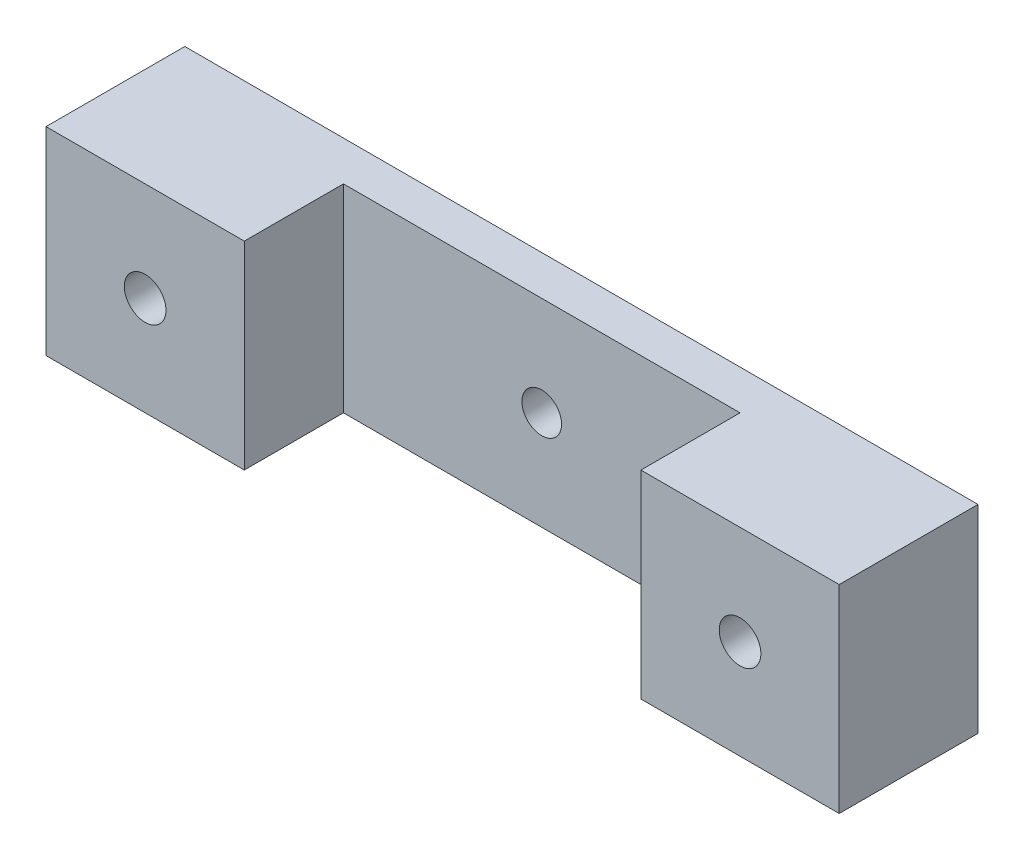
ISO-10303-21;
HEADER;
FILE_DESCRIPTION(('STEP AP214'),'2;1');
FILE_NAME('part.step','',(''),(''),'','','');
FILE_SCHEMA(('AUTOMOTIVE_DESIGN { 1 0 10303 214 1 1 1 1 }'));
ENDSEC;
DATA;
#1=APPLICATION_CONTEXT('core data for automotive mechanical design processes');
#2=APPLICATION_PROTOCOL_DEFINITION('international standard','automotive_design',2000,#1);
#3=PRODUCT_CONTEXT('',#1,'mechanical');
#4=PRODUCT('Part','Part','',(#3));
#5=PRODUCT_RELATED_PRODUCT_CATEGORY('part','',(#4));
#6=PRODUCT_DEFINITION_FORMATION('','',#4);
#7=PRODUCT_DEFINITION_CONTEXT('part definition',#1,'design');
#8=PRODUCT_DEFINITION('design','',#6,#7);
#9=PRODUCT_DEFINITION_SHAPE('','',#8);
#10=(LENGTH_UNIT() NAMED_UNIT(*) SI_UNIT(.MILLI.,.METRE.));
#11=(NAMED_UNIT(*) PLANE_ANGLE_UNIT() SI_UNIT($,.RADIAN.));
#12=(NAMED_UNIT(*) SI_UNIT($,.STERADIAN.) SOLID_ANGLE_UNIT());
#13=UNCERTAINTY_MEASURE_WITH_UNIT(LENGTH_MEASURE(1.E-05),#10,'distance_accuracy_value','');
#14=(GEOMETRIC_REPRESENTATION_CONTEXT(3) GLOBAL_UNCERTAINTY_ASSIGNED_CONTEXT((#13)) GLOBAL_UNIT_ASSIGNED_CONTEXT((#10,
#11,#12)) REPRESENTATION_CONTEXT('',''));
#15=CARTESIAN_POINT('',(0.,0.,0.));
#16=DIRECTION('',(0.,0.,1.));
#17=DIRECTION('',(1.,0.,0.));
#18=AXIS2_PLACEMENT_3D('',#15,#16,#17);
#19=CARTESIAN_POINT('',(0.,0.,4.));
#20=DIRECTION('',(0.,0.,-1.));
#21=DIRECTION('',(-1.,0.,0.));
#22=AXIS2_PLACEMENT_3D('',#19,#20,#21);
#23=PLANE('',#22);
#24=CARTESIAN_POINT('',(40.,10.,4.));
#25=DIRECTION('',(0.,0.,-1.));
#26=DIRECTION('',(-1.,0.,0.));
#27=AXIS2_PLACEMENT_3D('',#24,#25,#26);
#28=CIRCLE('',#27,2.);
#29=CARTESIAN_POINT('',(38.,10.,4.));
#30=VERTEX_POINT('',#29);
#31=EDGE_CURVE('E321',#30,#30,#28,.T.);
#32=ORIENTED_EDGE('',*,*,#31,.T.);
#33=EDGE_LOOP('',(#32));
#34=FACE_BOUND('',#33,.T.);
#35=DIRECTION('',(0.,-1.,0.));
#36=VECTOR('',#35,1.);
#37=CARTESIAN_POINT('',(60.,20.,4.));
#38=LINE('',#37,#36);
#39=CARTESIAN_POINT('',(60.,20.,4.));
#40=VERTEX_POINT('',#39);
#41=CARTESIAN_POINT('',(60.,0.,4.));
#42=VERTEX_POINT('',#41);
#43=EDGE_CURVE('E124',#40,#42,#38,.T.);
#44=ORIENTED_EDGE('',*,*,#43,.F.);
#45=DIRECTION('',(-1.,0.,0.));
#46=VECTOR('',#45,1.);
#47=CARTESIAN_POINT('',(0.,20.,4.));
#48=LINE('',#47,#46);
#49=CARTESIAN_POINT('',(20.,20.,4.));
#50=VERTEX_POINT('',#49);
#51=EDGE_CURVE('E156',#40,#50,#48,.T.);
#52=ORIENTED_EDGE('',*,*,#51,.T.);
#53=DIRECTION('',(0.,1.,0.));
#54=VECTOR('',#53,1.);
#55=CARTESIAN_POINT('',(20.,20.,4.));
#56=LINE('',#55,#54);
#57=CARTESIAN_POINT('',(20.,0.,4.));
#58=VERTEX_POINT('',#57);
#59=EDGE_CURVE('E55',#58,#50,#56,.T.);
#60=ORIENTED_EDGE('',*,*,#59,.F.);
#61=DIRECTION('',(1.,0.,0.));
#62=VECTOR('',#61,1.);
#63=CARTESIAN_POINT('',(0.,0.,4.));
#64=LINE('',#63,#62);
#65=EDGE_CURVE('E50',#58,#42,#64,.T.);
#66=ORIENTED_EDGE('',*,*,#65,.T.);
#67=EDGE_LOOP('',(#44,#52,#60,#66));
#68=FACE_BOUND('',#67,.T.);
#69=ADVANCED_FACE('F35',(#34,#68),#23,.F.);
#70=CARTESIAN_POINT('',(0.,0.,4.));
#71=DIRECTION('',(1.,0.,0.));
#72=DIRECTION('',(0.,0.,-1.));
#73=AXIS2_PLACEMENT_3D('',#70,#71,#72);
#74=PLANE('',#73);
#75=DIRECTION('',(0.,-1.,0.));
#76=VECTOR('',#75,1.);
#77=CARTESIAN_POINT('',(0.,0.,0.));
#78=LINE('',#77,#76);
#79=CARTESIAN_POINT('',(0.,20.,0.));
#80=VERTEX_POINT('',#79);
#81=CARTESIAN_POINT('',(0.,0.,0.));
#82=VERTEX_POINT('',#81);
#83=EDGE_CURVE('E154',#80,#82,#78,.T.);
#84=ORIENTED_EDGE('',*,*,#83,.T.);
#85=DIRECTION('',(0.,0.,-1.));
#86=VECTOR('',#85,1.);
#87=CARTESIAN_POINT('',(0.,0.,4.));
#88=LINE('',#87,#86);
#89=CARTESIAN_POINT('',(0.,0.,14.));
#90=VERTEX_POINT('',#89);
#91=EDGE_CURVE('E11',#90,#82,#88,.T.);
#92=ORIENTED_EDGE('',*,*,#91,.F.);
#93=DIRECTION('',(0.,-1.,0.));
#94=VECTOR('',#93,1.);
#95=CARTESIAN_POINT('',(0.,20.,14.));
#96=LINE('',#95,#94);
#97=CARTESIAN_POINT('',(0.,20.,14.));
#98=VERTEX_POINT('',#97);
#99=EDGE_CURVE('E137',#98,#90,#96,.T.);
#100=ORIENTED_EDGE('',*,*,#99,.F.);
#101=DIRECTION('',(0.,0.,-1.));
#102=VECTOR('',#101,1.);
#103=CARTESIAN_POINT('',(0.,20.,4.));
#104=LINE('',#103,#102);
#105=EDGE_CURVE('E109',#98,#80,#104,.T.);
#106=ORIENTED_EDGE('',*,*,#105,.T.);
#107=EDGE_LOOP('',(#84,#92,#100,#106));
#108=FACE_BOUND('',#107,.T.);
#109=ADVANCED_FACE('F37',(#108),#74,.F.);
#110=CARTESIAN_POINT('',(0.,0.,4.));
#111=DIRECTION('',(0.,1.,0.));
#112=DIRECTION('',(0.,0.,1.));
#113=AXIS2_PLACEMENT_3D('',#110,#111,#112);
#114=PLANE('',#113);
#115=DIRECTION('',(1.,0.,0.));
#116=VECTOR('',#115,1.);
#117=CARTESIAN_POINT('',(0.,0.,0.));
#118=LINE('',#117,#116);
#119=CARTESIAN_POINT('',(80.,0.,0.));
#120=VERTEX_POINT('',#119);
#121=EDGE_CURVE('E161',#82,#120,#118,.T.);
#122=ORIENTED_EDGE('',*,*,#121,.T.);
#123=DIRECTION('',(0.,0.,-1.));
#124=VECTOR('',#123,1.);
#125=CARTESIAN_POINT('',(80.,0.,4.));
#126=LINE('',#125,#124);
#127=CARTESIAN_POINT('',(80.,0.,14.));
#128=VERTEX_POINT('',#127);
#129=EDGE_CURVE('E43',#128,#120,#126,.T.);
#130=ORIENTED_EDGE('',*,*,#129,.F.);
#131=DIRECTION('',(1.,0.,0.));
#132=VECTOR('',#131,1.);
#133=CARTESIAN_POINT('',(80.,0.,14.));
#134=LINE('',#133,#132);
#135=CARTESIAN_POINT('',(60.,0.,14.));
#136=VERTEX_POINT('',#135);
#137=EDGE_CURVE('E123',#136,#128,#134,.T.);
#138=ORIENTED_EDGE('',*,*,#137,.F.);
#139=DIRECTION('',(0.,0.,-1.));
#140=VECTOR('',#139,1.);
#141=CARTESIAN_POINT('',(60.,0.,14.));
#142=LINE('',#141,#140);
#143=EDGE_CURVE('E132',#136,#42,#142,.T.);
#144=ORIENTED_EDGE('',*,*,#143,.T.);
#145=ORIENTED_EDGE('',*,*,#65,.F.);
#146=DIRECTION('',(0.,0.,-1.));
#147=VECTOR('',#146,1.);
#148=CARTESIAN_POINT('',(20.,0.,14.));
#149=LINE('',#148,#147);
#150=CARTESIAN_POINT('',(20.,0.,14.));
#151=VERTEX_POINT('',#150);
#152=EDGE_CURVE('E151',#151,#58,#149,.T.);
#153=ORIENTED_EDGE('',*,*,#152,.F.);
#154=DIRECTION('',(1.,0.,0.));
#155=VECTOR('',#154,1.);
#156=CARTESIAN_POINT('',(0.,0.,14.));
#157=LINE('',#156,#155);
#158=EDGE_CURVE('E140',#90,#151,#157,.T.);
#159=ORIENTED_EDGE('',*,*,#158,.F.);
#160=ORIENTED_EDGE('',*,*,#91,.T.);
#161=EDGE_LOOP('',(#122,#130,#138,#144,#145,#153,#159,#160));
#162=FACE_BOUND('',#161,.T.);
#163=ADVANCED_FACE('F181',(#162),#114,.F.);
#164=CARTESIAN_POINT('',(80.,0.,4.));
#165=DIRECTION('',(-1.,0.,0.));
#166=DIRECTION('',(0.,0.,1.));
#167=AXIS2_PLACEMENT_3D('',#164,#165,#166);
#168=PLANE('',#167);
#169=DIRECTION('',(0.,1.,0.));
#170=VECTOR('',#169,1.);
#171=CARTESIAN_POINT('',(80.,0.,0.));
#172=LINE('',#171,#170);
#173=CARTESIAN_POINT('',(80.,20.,0.));
#174=VERTEX_POINT('',#173);
#175=EDGE_CURVE('E106',#120,#174,#172,.T.);
#176=ORIENTED_EDGE('',*,*,#175,.T.);
#177=DIRECTION('',(0.,0.,-1.));
#178=VECTOR('',#177,1.);
#179=CARTESIAN_POINT('',(80.,20.,4.));
#180=LINE('',#179,#178);
#181=CARTESIAN_POINT('',(80.,20.,14.));
#182=VERTEX_POINT('',#181);
#183=EDGE_CURVE('E99',#182,#174,#180,.T.);
#184=ORIENTED_EDGE('',*,*,#183,.F.);
#185=DIRECTION('',(0.,1.,0.));
#186=VECTOR('',#185,1.);
#187=CARTESIAN_POINT('',(80.,20.,14.));
#188=LINE('',#187,#186);
#189=EDGE_CURVE('E104',#128,#182,#188,.T.);
#190=ORIENTED_EDGE('',*,*,#189,.F.);
#191=ORIENTED_EDGE('',*,*,#129,.T.);
#192=EDGE_LOOP('',(#176,#184,#190,#191));
#193=FACE_BOUND('',#192,.T.);
#194=ADVANCED_FACE('F101',(#193),#168,.F.);
#195=CARTESIAN_POINT('',(0.,20.,4.));
#196=DIRECTION('',(0.,-1.,0.));
#197=DIRECTION('',(0.,0.,-1.));
#198=AXIS2_PLACEMENT_3D('',#195,#196,#197);
#199=PLANE('',#198);
#200=DIRECTION('',(-1.,0.,0.));
#201=VECTOR('',#200,1.);
#202=CARTESIAN_POINT('',(0.,20.,0.));
#203=LINE('',#202,#201);
#204=EDGE_CURVE('E157',#174,#80,#203,.T.);
#205=ORIENTED_EDGE('',*,*,#204,.T.);
#206=ORIENTED_EDGE('',*,*,#105,.F.);
#207=DIRECTION('',(-1.,0.,0.));
#208=VECTOR('',#207,1.);
#209=CARTESIAN_POINT('',(0.,20.,14.));
#210=LINE('',#209,#208);
#211=CARTESIAN_POINT('',(20.,20.,14.));
#212=VERTEX_POINT('',#211);
#213=EDGE_CURVE('E144',#212,#98,#210,.T.);
#214=ORIENTED_EDGE('',*,*,#213,.F.);
#215=DIRECTION('',(0.,0.,-1.));
#216=VECTOR('',#215,1.);
#217=CARTESIAN_POINT('',(20.,20.,14.));
#218=LINE('',#217,#216);
#219=EDGE_CURVE('E147',#212,#50,#218,.T.);
#220=ORIENTED_EDGE('',*,*,#219,.T.);
#221=ORIENTED_EDGE('',*,*,#51,.F.);
#222=DIRECTION('',(0.,0.,-1.));
#223=VECTOR('',#222,1.);
#224=CARTESIAN_POINT('',(60.,20.,14.));
#225=LINE('',#224,#223);
#226=CARTESIAN_POINT('',(60.,20.,14.));
#227=VERTEX_POINT('',#226);
#228=EDGE_CURVE('E115',#227,#40,#225,.T.);
#229=ORIENTED_EDGE('',*,*,#228,.F.);
#230=DIRECTION('',(-1.,0.,0.));
#231=VECTOR('',#230,1.);
#232=CARTESIAN_POINT('',(80.,20.,14.));
#233=LINE('',#232,#231);
#234=EDGE_CURVE('E112',#182,#227,#233,.T.);
#235=ORIENTED_EDGE('',*,*,#234,.F.);
#236=ORIENTED_EDGE('',*,*,#183,.T.);
#237=EDGE_LOOP('',(#205,#206,#214,#220,#221,#229,#235,#236));
#238=FACE_BOUND('',#237,.T.);
#239=ADVANCED_FACE('F113',(#238),#199,.F.);
#240=CARTESIAN_POINT('',(0.,0.,0.));
#241=DIRECTION('',(0.,0.,-1.));
#242=DIRECTION('',(-1.,0.,0.));
#243=AXIS2_PLACEMENT_3D('',#240,#241,#242);
#244=PLANE('',#243);
#245=CARTESIAN_POINT('',(40.,10.,0.));
#246=DIRECTION('',(0.,0.,-1.));
#247=DIRECTION('',(-1.,0.,0.));
#248=AXIS2_PLACEMENT_3D('',#245,#246,#247);
#249=CIRCLE('',#248,2.);
#250=CARTESIAN_POINT('',(38.,10.,0.));
#251=VERTEX_POINT('',#250);
#252=EDGE_CURVE('E319',#251,#251,#249,.T.);
#253=ORIENTED_EDGE('',*,*,#252,.F.);
#254=EDGE_LOOP('',(#253));
#255=FACE_BOUND('',#254,.T.);
#256=CARTESIAN_POINT('',(70.,10.,0.));
#257=DIRECTION('',(0.,0.,-1.));
#258=DIRECTION('',(-1.,0.,0.));
#259=AXIS2_PLACEMENT_3D('',#256,#257,#258);
#260=CIRCLE('',#259,2.1);
#261=CARTESIAN_POINT('',(67.9,10.,0.));
#262=VERTEX_POINT('',#261);
#263=EDGE_CURVE('E325',#262,#262,#260,.T.);
#264=ORIENTED_EDGE('',*,*,#263,.F.);
#265=EDGE_LOOP('',(#264));
#266=FACE_BOUND('',#265,.T.);
#267=CARTESIAN_POINT('',(10.,10.,0.));
#268=DIRECTION('',(0.,0.,-1.));
#269=DIRECTION('',(-1.,0.,0.));
#270=AXIS2_PLACEMENT_3D('',#267,#268,#269);
#271=CIRCLE('',#270,2.1);
#272=CARTESIAN_POINT('',(7.9,10.,0.));
#273=VERTEX_POINT('',#272);
#274=EDGE_CURVE('E126',#273,#273,#271,.T.);
#275=ORIENTED_EDGE('',*,*,#274,.F.);
#276=EDGE_LOOP('',(#275));
#277=FACE_BOUND('',#276,.T.);
#278=ORIENTED_EDGE('',*,*,#83,.F.);
#279=ORIENTED_EDGE('',*,*,#204,.F.);
#280=ORIENTED_EDGE('',*,*,#175,.F.);
#281=ORIENTED_EDGE('',*,*,#121,.F.);
#282=EDGE_LOOP('',(#278,#279,#280,#281));
#283=FACE_BOUND('',#282,.T.);
#284=ADVANCED_FACE('F169',(#255,#266,#277,#283),#244,.T.);
#285=CARTESIAN_POINT('',(20.,20.,14.));
#286=DIRECTION('',(-1.,0.,0.));
#287=DIRECTION('',(0.,-1.,0.));
#288=AXIS2_PLACEMENT_3D('',#285,#286,#287);
#289=PLANE('',#288);
#290=ORIENTED_EDGE('',*,*,#59,.T.);
#291=ORIENTED_EDGE('',*,*,#219,.F.);
#292=DIRECTION('',(0.,1.,0.));
#293=VECTOR('',#292,1.);
#294=CARTESIAN_POINT('',(20.,20.,14.));
#295=LINE('',#294,#293);
#296=EDGE_CURVE('E142',#151,#212,#295,.T.);
#297=ORIENTED_EDGE('',*,*,#296,.F.);
#298=ORIENTED_EDGE('',*,*,#152,.T.);
#299=EDGE_LOOP('',(#290,#291,#297,#298));
#300=FACE_BOUND('',#299,.T.);
#301=ADVANCED_FACE('F180',(#300),#289,.F.);
#302=CARTESIAN_POINT('',(0.,0.,14.));
#303=DIRECTION('',(0.,0.,1.));
#304=DIRECTION('',(1.,0.,0.));
#305=AXIS2_PLACEMENT_3D('',#302,#303,#304);
#306=PLANE('',#305);
#307=CARTESIAN_POINT('',(10.,10.,14.));
#308=DIRECTION('',(0.,0.,1.));
#309=DIRECTION('',(1.,0.,0.));
#310=AXIS2_PLACEMENT_3D('',#307,#308,#309);
#311=CIRCLE('',#310,2.1);
#312=CARTESIAN_POINT('',(12.1,10.,14.));
#313=VERTEX_POINT('',#312);
#314=EDGE_CURVE('E330',#313,#313,#311,.T.);
#315=ORIENTED_EDGE('',*,*,#314,.F.);
#316=EDGE_LOOP('',(#315));
#317=FACE_BOUND('',#316,.T.);
#318=ORIENTED_EDGE('',*,*,#99,.T.);
#319=ORIENTED_EDGE('',*,*,#158,.T.);
#320=ORIENTED_EDGE('',*,*,#296,.T.);
#321=ORIENTED_EDGE('',*,*,#213,.T.);
#322=EDGE_LOOP('',(#318,#319,#320,#321));
#323=FACE_BOUND('',#322,.T.);
#324=ADVANCED_FACE('F175',(#317,#323),#306,.T.);
#325=CARTESIAN_POINT('',(60.,20.,14.));
#326=DIRECTION('',(1.,0.,0.));
#327=DIRECTION('',(0.,0.,-1.));
#328=AXIS2_PLACEMENT_3D('',#325,#326,#327);
#329=PLANE('',#328);
#330=ORIENTED_EDGE('',*,*,#43,.T.);
#331=ORIENTED_EDGE('',*,*,#143,.F.);
#332=DIRECTION('',(0.,-1.,0.));
#333=VECTOR('',#332,1.);
#334=CARTESIAN_POINT('',(60.,20.,14.));
#335=LINE('',#334,#333);
#336=EDGE_CURVE('E118',#227,#136,#335,.T.);
#337=ORIENTED_EDGE('',*,*,#336,.F.);
#338=ORIENTED_EDGE('',*,*,#228,.T.);
#339=EDGE_LOOP('',(#330,#331,#337,#338));
#340=FACE_BOUND('',#339,.T.);
#341=ADVANCED_FACE('F184',(#340),#329,.F.);
#342=CARTESIAN_POINT('',(0.,0.,14.));
#343=DIRECTION('',(0.,0.,-1.));
#344=DIRECTION('',(-1.,0.,0.));
#345=AXIS2_PLACEMENT_3D('',#342,#343,#344);
#346=PLANE('',#345);
#347=CARTESIAN_POINT('',(70.,10.,14.));
#348=DIRECTION('',(0.,0.,1.));
#349=DIRECTION('',(1.,0.,0.));
#350=AXIS2_PLACEMENT_3D('',#347,#348,#349);
#351=CIRCLE('',#350,2.1);
#352=CARTESIAN_POINT('',(72.1,10.,14.));
#353=VERTEX_POINT('',#352);
#354=EDGE_CURVE('E322',#353,#353,#351,.T.);
#355=ORIENTED_EDGE('',*,*,#354,.F.);
#356=EDGE_LOOP('',(#355));
#357=FACE_BOUND('',#356,.T.);
#358=ORIENTED_EDGE('',*,*,#189,.T.);
#359=ORIENTED_EDGE('',*,*,#234,.T.);
#360=ORIENTED_EDGE('',*,*,#336,.T.);
#361=ORIENTED_EDGE('',*,*,#137,.T.);
#362=EDGE_LOOP('',(#358,#359,#360,#361));
#363=FACE_BOUND('',#362,.T.);
#364=ADVANCED_FACE('F121',(#357,#363),#346,.F.);
#365=CARTESIAN_POINT('',(10.,10.,-6.));
#366=DIRECTION('',(0.,0.,1.));
#367=DIRECTION('',(1.,0.,0.));
#368=AXIS2_PLACEMENT_3D('',#365,#366,#367);
#369=CYLINDRICAL_SURFACE('',#368,2.1);
#370=ORIENTED_EDGE('',*,*,#274,.T.);
#371=EDGE_LOOP('',(#370));
#372=FACE_BOUND('',#371,.T.);
#373=ORIENTED_EDGE('',*,*,#314,.T.);
#374=EDGE_LOOP('',(#373));
#375=FACE_BOUND('',#374,.T.);
#376=ADVANCED_FACE('F242',(#372,#375),#369,.F.);
#377=CARTESIAN_POINT('',(70.,10.,-6.));
#378=DIRECTION('',(0.,0.,1.));
#379=DIRECTION('',(1.,0.,0.));
#380=AXIS2_PLACEMENT_3D('',#377,#378,#379);
#381=CYLINDRICAL_SURFACE('',#380,2.1);
#382=ORIENTED_EDGE('',*,*,#263,.T.);
#383=EDGE_LOOP('',(#382));
#384=FACE_BOUND('',#383,.T.);
#385=ORIENTED_EDGE('',*,*,#354,.T.);
#386=EDGE_LOOP('',(#385));
#387=FACE_BOUND('',#386,.T.);
#388=ADVANCED_FACE('F250',(#384,#387),#381,.F.);
#389=CARTESIAN_POINT('',(40.,10.,20.));
#390=DIRECTION('',(0.,0.,-1.));
#391=DIRECTION('',(-1.,0.,0.));
#392=AXIS2_PLACEMENT_3D('',#389,#390,#391);
#393=CYLINDRICAL_SURFACE('',#392,2.);
#394=ORIENTED_EDGE('',*,*,#252,.T.);
#395=EDGE_LOOP('',(#394));
#396=FACE_BOUND('',#395,.T.);
#397=ORIENTED_EDGE('',*,*,#31,.F.);
#398=EDGE_LOOP('',(#397));
#399=FACE_BOUND('',#398,.T.);
#400=ADVANCED_FACE('F258',(#396,#399),#393,.F.);
#401=CLOSED_SHELL('',(#69,#109,#163,#194,#239,#284,#301,#324,#341,#364,#376,#388,#400));
#402=MANIFOLD_SOLID_BREP('B2',#401);
#403=ADVANCED_BREP_SHAPE_REPRESENTATION('',(#18,#402),#14);
#404=SHAPE_DEFINITION_REPRESENTATION(#9,#403);
ENDSEC;
END-ISO-10303-21;
